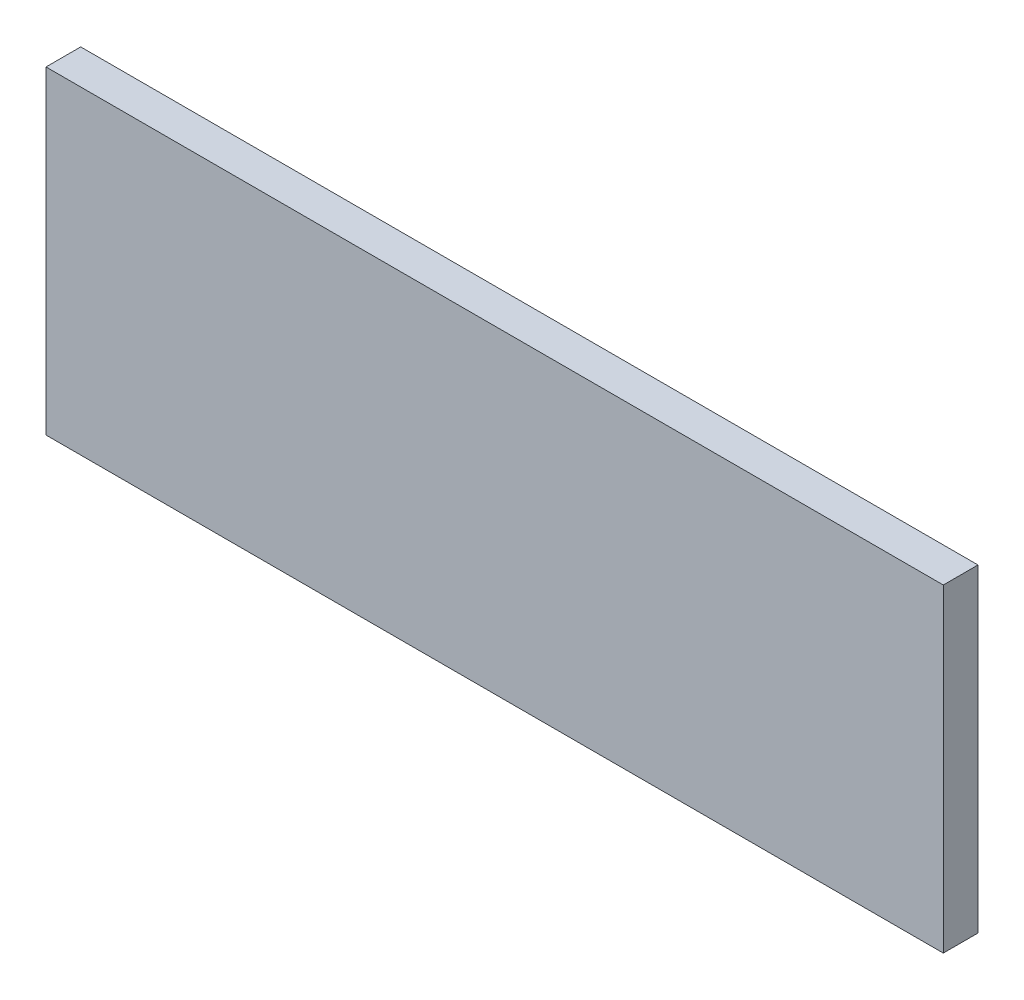
ISO-10303-21;
HEADER;
FILE_DESCRIPTION(('STEP AP214'),'2;1');
FILE_NAME('part.step','',(''),(''),'','','');
FILE_SCHEMA(('AUTOMOTIVE_DESIGN { 1 0 10303 214 1 1 1 1 }'));
ENDSEC;
DATA;
#1=APPLICATION_CONTEXT('core data for automotive mechanical design processes');
#2=APPLICATION_PROTOCOL_DEFINITION('international standard','automotive_design',2000,#1);
#3=PRODUCT_CONTEXT('',#1,'mechanical');
#4=PRODUCT('Part','Part','',(#3));
#5=PRODUCT_RELATED_PRODUCT_CATEGORY('part','',(#4));
#6=PRODUCT_DEFINITION_FORMATION('','',#4);
#7=PRODUCT_DEFINITION_CONTEXT('part definition',#1,'design');
#8=PRODUCT_DEFINITION('design','',#6,#7);
#9=PRODUCT_DEFINITION_SHAPE('','',#8);
#10=(LENGTH_UNIT() NAMED_UNIT(*) SI_UNIT(.MILLI.,.METRE.));
#11=(NAMED_UNIT(*) PLANE_ANGLE_UNIT() SI_UNIT($,.RADIAN.));
#12=(NAMED_UNIT(*) SI_UNIT($,.STERADIAN.) SOLID_ANGLE_UNIT());
#13=UNCERTAINTY_MEASURE_WITH_UNIT(LENGTH_MEASURE(1.E-05),#10,'distance_accuracy_value','');
#14=(GEOMETRIC_REPRESENTATION_CONTEXT(3) GLOBAL_UNCERTAINTY_ASSIGNED_CONTEXT((#13)) GLOBAL_UNIT_ASSIGNED_CONTEXT((#10,
#11,#12)) REPRESENTATION_CONTEXT('',''));
#15=CARTESIAN_POINT('',(0.,0.,0.));
#16=DIRECTION('',(0.,0.,1.));
#17=DIRECTION('',(1.,0.,0.));
#18=AXIS2_PLACEMENT_3D('',#15,#16,#17);
#19=CARTESIAN_POINT('',(0.,0.,100.));
#20=DIRECTION('',(0.,0.,-1.));
#21=DIRECTION('',(-1.,0.,0.));
#22=AXIS2_PLACEMENT_3D('',#19,#20,#21);
#23=PLANE('',#22);
#24=DIRECTION('',(1.,0.,0.));
#25=VECTOR('',#24,1.);
#26=CARTESIAN_POINT('',(0.,-49.7558230565742,100.));
#27=LINE('',#26,#25);
#28=CARTESIAN_POINT('',(-51.6257701653478,-49.7558230565742,100.));
#29=VERTEX_POINT('',#28);
#30=CARTESIAN_POINT('',(3050.57068316712,-49.7558230565742,100.));
#31=VERTEX_POINT('',#30);
#32=EDGE_CURVE('E140',#29,#31,#27,.T.);
#33=ORIENTED_EDGE('',*,*,#32,.T.);
#34=DIRECTION('',(0.,-1.,0.));
#35=VECTOR('',#34,1.);
#36=CARTESIAN_POINT('',(3050.57068316712,0.,100.));
#37=LINE('',#36,#35);
#38=CARTESIAN_POINT('',(3050.57068316712,1052.40998755289,100.));
#39=VERTEX_POINT('',#38);
#40=EDGE_CURVE('E143',#39,#31,#37,.T.);
#41=ORIENTED_EDGE('',*,*,#40,.F.);
#42=DIRECTION('',(1.,0.,0.));
#43=VECTOR('',#42,1.);
#44=CARTESIAN_POINT('',(0.,1052.40998755289,100.));
#45=LINE('',#44,#43);
#46=CARTESIAN_POINT('',(-51.6257701653478,1052.40998755289,100.));
#47=VERTEX_POINT('',#46);
#48=EDGE_CURVE('E146',#47,#39,#45,.T.);
#49=ORIENTED_EDGE('',*,*,#48,.F.);
#50=DIRECTION('',(0.,-1.,0.));
#51=VECTOR('',#50,1.);
#52=CARTESIAN_POINT('',(-51.6257701653478,0.,100.));
#53=LINE('',#52,#51);
#54=EDGE_CURVE('E118',#47,#29,#53,.T.);
#55=ORIENTED_EDGE('',*,*,#54,.T.);
#56=EDGE_LOOP('',(#33,#41,#49,#55));
#57=FACE_BOUND('',#56,.T.);
#58=ADVANCED_FACE('F39',(#57),#23,.F.);
#59=CARTESIAN_POINT('',(0.,-49.7558230565742,-20.));
#60=DIRECTION('',(0.,-1.,0.));
#61=DIRECTION('',(0.,0.,-1.));
#62=AXIS2_PLACEMENT_3D('',#59,#60,#61);
#63=PLANE('',#62);
#64=ORIENTED_EDGE('',*,*,#32,.F.);
#65=DIRECTION('',(0.,0.,1.));
#66=VECTOR('',#65,1.);
#67=CARTESIAN_POINT('',(-51.6257701653478,-49.7558230565742,-20.));
#68=LINE('',#67,#66);
#69=CARTESIAN_POINT('',(-51.6257701653478,-49.7558230565742,-20.));
#70=VERTEX_POINT('',#69);
#71=EDGE_CURVE('E151',#70,#29,#68,.T.);
#72=ORIENTED_EDGE('',*,*,#71,.F.);
#73=DIRECTION('',(1.,0.,0.));
#74=VECTOR('',#73,1.);
#75=CARTESIAN_POINT('',(0.,-49.7558230565742,-20.));
#76=LINE('',#75,#74);
#77=CARTESIAN_POINT('',(3050.57068316712,-49.7558230565742,-20.));
#78=VERTEX_POINT('',#77);
#79=EDGE_CURVE('E130',#70,#78,#76,.T.);
#80=ORIENTED_EDGE('',*,*,#79,.T.);
#81=DIRECTION('',(0.,0.,1.));
#82=VECTOR('',#81,1.);
#83=CARTESIAN_POINT('',(3050.57068316712,-49.7558230565742,-20.));
#84=LINE('',#83,#82);
#85=EDGE_CURVE('E159',#78,#31,#84,.T.);
#86=ORIENTED_EDGE('',*,*,#85,.T.);
#87=EDGE_LOOP('',(#64,#72,#80,#86));
#88=FACE_BOUND('',#87,.T.);
#89=ADVANCED_FACE('F179',(#88),#63,.T.);
#90=CARTESIAN_POINT('',(-51.6257701653478,0.,-20.));
#91=DIRECTION('',(-1.,0.,0.));
#92=DIRECTION('',(0.,0.,1.));
#93=AXIS2_PLACEMENT_3D('',#90,#91,#92);
#94=PLANE('',#93);
#95=ORIENTED_EDGE('',*,*,#54,.F.);
#96=DIRECTION('',(0.,0.,1.));
#97=VECTOR('',#96,1.);
#98=CARTESIAN_POINT('',(-51.6257701653478,1052.40998755289,-20.));
#99=LINE('',#98,#97);
#100=CARTESIAN_POINT('',(-51.6257701653478,1052.40998755289,-20.));
#101=VERTEX_POINT('',#100);
#102=EDGE_CURVE('E154',#101,#47,#99,.T.);
#103=ORIENTED_EDGE('',*,*,#102,.F.);
#104=DIRECTION('',(0.,-1.,0.));
#105=VECTOR('',#104,1.);
#106=CARTESIAN_POINT('',(-51.6257701653478,0.,-20.));
#107=LINE('',#106,#105);
#108=EDGE_CURVE('E109',#101,#70,#107,.T.);
#109=ORIENTED_EDGE('',*,*,#108,.T.);
#110=ORIENTED_EDGE('',*,*,#71,.T.);
#111=EDGE_LOOP('',(#95,#103,#109,#110));
#112=FACE_BOUND('',#111,.T.);
#113=ADVANCED_FACE('F184',(#112),#94,.T.);
#114=CARTESIAN_POINT('',(0.,1052.40998755289,-20.));
#115=DIRECTION('',(0.,-1.,0.));
#116=DIRECTION('',(0.,0.,-1.));
#117=AXIS2_PLACEMENT_3D('',#114,#115,#116);
#118=PLANE('',#117);
#119=ORIENTED_EDGE('',*,*,#48,.T.);
#120=DIRECTION('',(0.,0.,1.));
#121=VECTOR('',#120,1.);
#122=CARTESIAN_POINT('',(3050.57068316712,1052.40998755289,-20.));
#123=LINE('',#122,#121);
#124=CARTESIAN_POINT('',(3050.57068316712,1052.40998755289,-20.));
#125=VERTEX_POINT('',#124);
#126=EDGE_CURVE('E156',#125,#39,#123,.T.);
#127=ORIENTED_EDGE('',*,*,#126,.F.);
#128=DIRECTION('',(1.,0.,0.));
#129=VECTOR('',#128,1.);
#130=CARTESIAN_POINT('',(0.,1052.40998755289,-20.));
#131=LINE('',#130,#129);
#132=EDGE_CURVE('E135',#101,#125,#131,.T.);
#133=ORIENTED_EDGE('',*,*,#132,.F.);
#134=ORIENTED_EDGE('',*,*,#102,.T.);
#135=EDGE_LOOP('',(#119,#127,#133,#134));
#136=FACE_BOUND('',#135,.T.);
#137=ADVANCED_FACE('F190',(#136),#118,.F.);
#138=CARTESIAN_POINT('',(3000.,0.,-20.));
#139=DIRECTION('',(1.,0.,0.));
#140=DIRECTION('',(0.,0.,-1.));
#141=AXIS2_PLACEMENT_3D('',#138,#139,#140);
#142=PLANE('',#141);
#143=DIRECTION('',(0.,1.,0.));
#144=VECTOR('',#143,1.);
#145=CARTESIAN_POINT('',(3000.,0.,0.));
#146=LINE('',#145,#144);
#147=CARTESIAN_POINT('',(3000.,0.,0.));
#148=VERTEX_POINT('',#147);
#149=CARTESIAN_POINT('',(3000.,1000.,0.));
#150=VERTEX_POINT('',#149);
#151=EDGE_CURVE('E47',#148,#150,#146,.T.);
#152=ORIENTED_EDGE('',*,*,#151,.T.);
#153=DIRECTION('',(0.,0.,1.));
#154=VECTOR('',#153,1.);
#155=CARTESIAN_POINT('',(3000.,1000.,-20.));
#156=LINE('',#155,#154);
#157=CARTESIAN_POINT('',(3000.,1000.,-20.));
#158=VERTEX_POINT('',#157);
#159=EDGE_CURVE('E116',#158,#150,#156,.T.);
#160=ORIENTED_EDGE('',*,*,#159,.F.);
#161=DIRECTION('',(0.,1.,0.));
#162=VECTOR('',#161,1.);
#163=CARTESIAN_POINT('',(3000.,0.,-20.));
#164=LINE('',#163,#162);
#165=CARTESIAN_POINT('',(3000.,0.,-20.));
#166=VERTEX_POINT('',#165);
#167=EDGE_CURVE('E113',#166,#158,#164,.T.);
#168=ORIENTED_EDGE('',*,*,#167,.F.);
#169=DIRECTION('',(0.,0.,1.));
#170=VECTOR('',#169,1.);
#171=CARTESIAN_POINT('',(3000.,0.,-20.));
#172=LINE('',#171,#170);
#173=EDGE_CURVE('E101',#166,#148,#172,.T.);
#174=ORIENTED_EDGE('',*,*,#173,.T.);
#175=EDGE_LOOP('',(#152,#160,#168,#174));
#176=FACE_BOUND('',#175,.T.);
#177=ADVANCED_FACE('F114',(#176),#142,.F.);
#178=CARTESIAN_POINT('',(0.,1000.,-20.));
#179=DIRECTION('',(0.,1.,0.));
#180=DIRECTION('',(0.,0.,1.));
#181=AXIS2_PLACEMENT_3D('',#178,#179,#180);
#182=PLANE('',#181);
#183=DIRECTION('',(1.,0.,0.));
#184=VECTOR('',#183,1.);
#185=CARTESIAN_POINT('',(0.,1000.,0.));
#186=LINE('',#185,#184);
#187=CARTESIAN_POINT('',(0.,1000.,0.));
#188=VERTEX_POINT('',#187);
#189=EDGE_CURVE('E57',#188,#150,#186,.T.);
#190=ORIENTED_EDGE('',*,*,#189,.F.);
#191=DIRECTION('',(0.,0.,1.));
#192=VECTOR('',#191,1.);
#193=CARTESIAN_POINT('',(0.,1000.,-20.));
#194=LINE('',#193,#192);
#195=CARTESIAN_POINT('',(0.,1000.,-20.));
#196=VERTEX_POINT('',#195);
#197=EDGE_CURVE('E162',#196,#188,#194,.T.);
#198=ORIENTED_EDGE('',*,*,#197,.F.);
#199=DIRECTION('',(-1.,0.,0.));
#200=VECTOR('',#199,1.);
#201=CARTESIAN_POINT('',(0.,1000.,-20.));
#202=LINE('',#201,#200);
#203=EDGE_CURVE('E126',#158,#196,#202,.T.);
#204=ORIENTED_EDGE('',*,*,#203,.F.);
#205=ORIENTED_EDGE('',*,*,#159,.T.);
#206=EDGE_LOOP('',(#190,#198,#204,#205));
#207=FACE_BOUND('',#206,.T.);
#208=ADVANCED_FACE('F168',(#207),#182,.F.);
#209=CARTESIAN_POINT('',(0.,0.,-20.));
#210=DIRECTION('',(-1.,0.,0.));
#211=DIRECTION('',(0.,0.,1.));
#212=AXIS2_PLACEMENT_3D('',#209,#210,#211);
#213=PLANE('',#212);
#214=DIRECTION('',(0.,1.,0.));
#215=VECTOR('',#214,1.);
#216=CARTESIAN_POINT('',(0.,0.,0.));
#217=LINE('',#216,#215);
#218=CARTESIAN_POINT('',(0.,0.,0.));
#219=VERTEX_POINT('',#218);
#220=EDGE_CURVE('E153',#219,#188,#217,.T.);
#221=ORIENTED_EDGE('',*,*,#220,.F.);
#222=DIRECTION('',(0.,0.,1.));
#223=VECTOR('',#222,1.);
#224=CARTESIAN_POINT('',(0.,0.,-20.));
#225=LINE('',#224,#223);
#226=CARTESIAN_POINT('',(0.,0.,-20.));
#227=VERTEX_POINT('',#226);
#228=EDGE_CURVE('E108',#227,#219,#225,.T.);
#229=ORIENTED_EDGE('',*,*,#228,.F.);
#230=DIRECTION('',(0.,-1.,0.));
#231=VECTOR('',#230,1.);
#232=CARTESIAN_POINT('',(0.,0.,-20.));
#233=LINE('',#232,#231);
#234=EDGE_CURVE('E123',#196,#227,#233,.T.);
#235=ORIENTED_EDGE('',*,*,#234,.F.);
#236=ORIENTED_EDGE('',*,*,#197,.T.);
#237=EDGE_LOOP('',(#221,#229,#235,#236));
#238=FACE_BOUND('',#237,.T.);
#239=ADVANCED_FACE('F171',(#238),#213,.F.);
#240=CARTESIAN_POINT('',(0.,0.,-20.));
#241=DIRECTION('',(0.,1.,0.));
#242=DIRECTION('',(0.,0.,1.));
#243=AXIS2_PLACEMENT_3D('',#240,#241,#242);
#244=PLANE('',#243);
#245=ORIENTED_EDGE('',*,*,#228,.T.);
#246=DIRECTION('',(1.,0.,0.));
#247=VECTOR('',#246,1.);
#248=CARTESIAN_POINT('',(0.,0.,0.));
#249=LINE('',#248,#247);
#250=EDGE_CURVE('E11',#219,#148,#249,.T.);
#251=ORIENTED_EDGE('',*,*,#250,.T.);
#252=ORIENTED_EDGE('',*,*,#173,.F.);
#253=DIRECTION('',(-1.,0.,0.));
#254=VECTOR('',#253,1.);
#255=CARTESIAN_POINT('',(0.,0.,-20.));
#256=LINE('',#255,#254);
#257=EDGE_CURVE('E106',#166,#227,#256,.T.);
#258=ORIENTED_EDGE('',*,*,#257,.T.);
#259=EDGE_LOOP('',(#245,#251,#252,#258));
#260=FACE_BOUND('',#259,.T.);
#261=ADVANCED_FACE('F104',(#260),#244,.T.);
#262=CARTESIAN_POINT('',(3050.57068316712,0.,-20.));
#263=DIRECTION('',(-1.,0.,0.));
#264=DIRECTION('',(0.,0.,1.));
#265=AXIS2_PLACEMENT_3D('',#262,#263,#264);
#266=PLANE('',#265);
#267=ORIENTED_EDGE('',*,*,#40,.T.);
#268=ORIENTED_EDGE('',*,*,#85,.F.);
#269=DIRECTION('',(0.,-1.,0.));
#270=VECTOR('',#269,1.);
#271=CARTESIAN_POINT('',(3050.57068316712,0.,-20.));
#272=LINE('',#271,#270);
#273=EDGE_CURVE('E133',#125,#78,#272,.T.);
#274=ORIENTED_EDGE('',*,*,#273,.F.);
#275=ORIENTED_EDGE('',*,*,#126,.T.);
#276=EDGE_LOOP('',(#267,#268,#274,#275));
#277=FACE_BOUND('',#276,.T.);
#278=ADVANCED_FACE('F176',(#277),#266,.F.);
#279=CARTESIAN_POINT('',(0.,0.,-20.));
#280=DIRECTION('',(0.,0.,1.));
#281=DIRECTION('',(1.,0.,0.));
#282=AXIS2_PLACEMENT_3D('',#279,#280,#281);
#283=PLANE('',#282);
#284=ORIENTED_EDGE('',*,*,#167,.T.);
#285=ORIENTED_EDGE('',*,*,#203,.T.);
#286=ORIENTED_EDGE('',*,*,#234,.T.);
#287=ORIENTED_EDGE('',*,*,#257,.F.);
#288=EDGE_LOOP('',(#284,#285,#286,#287));
#289=FACE_BOUND('',#288,.T.);
#290=ORIENTED_EDGE('',*,*,#79,.F.);
#291=ORIENTED_EDGE('',*,*,#108,.F.);
#292=ORIENTED_EDGE('',*,*,#132,.T.);
#293=ORIENTED_EDGE('',*,*,#273,.T.);
#294=EDGE_LOOP('',(#290,#291,#292,#293));
#295=FACE_BOUND('',#294,.T.);
#296=ADVANCED_FACE('F120',(#289,#295),#283,.F.);
#297=CARTESIAN_POINT('',(0.,0.,0.));
#298=DIRECTION('',(0.,0.,-1.));
#299=DIRECTION('',(-1.,0.,0.));
#300=AXIS2_PLACEMENT_3D('',#297,#298,#299);
#301=PLANE('',#300);
#302=ORIENTED_EDGE('',*,*,#220,.T.);
#303=ORIENTED_EDGE('',*,*,#189,.T.);
#304=ORIENTED_EDGE('',*,*,#151,.F.);
#305=ORIENTED_EDGE('',*,*,#250,.F.);
#306=EDGE_LOOP('',(#302,#303,#304,#305));
#307=FACE_BOUND('',#306,.T.);
#308=ADVANCED_FACE('F41',(#307),#301,.T.);
#309=CLOSED_SHELL('',(#58,#89,#113,#137,#177,#208,#239,#261,#278,#296,#308));
#310=MANIFOLD_SOLID_BREP('B2',#309);
#311=ADVANCED_BREP_SHAPE_REPRESENTATION('',(#18,#310),#14);
#312=SHAPE_DEFINITION_REPRESENTATION(#9,#311);
ENDSEC;
END-ISO-10303-21;
